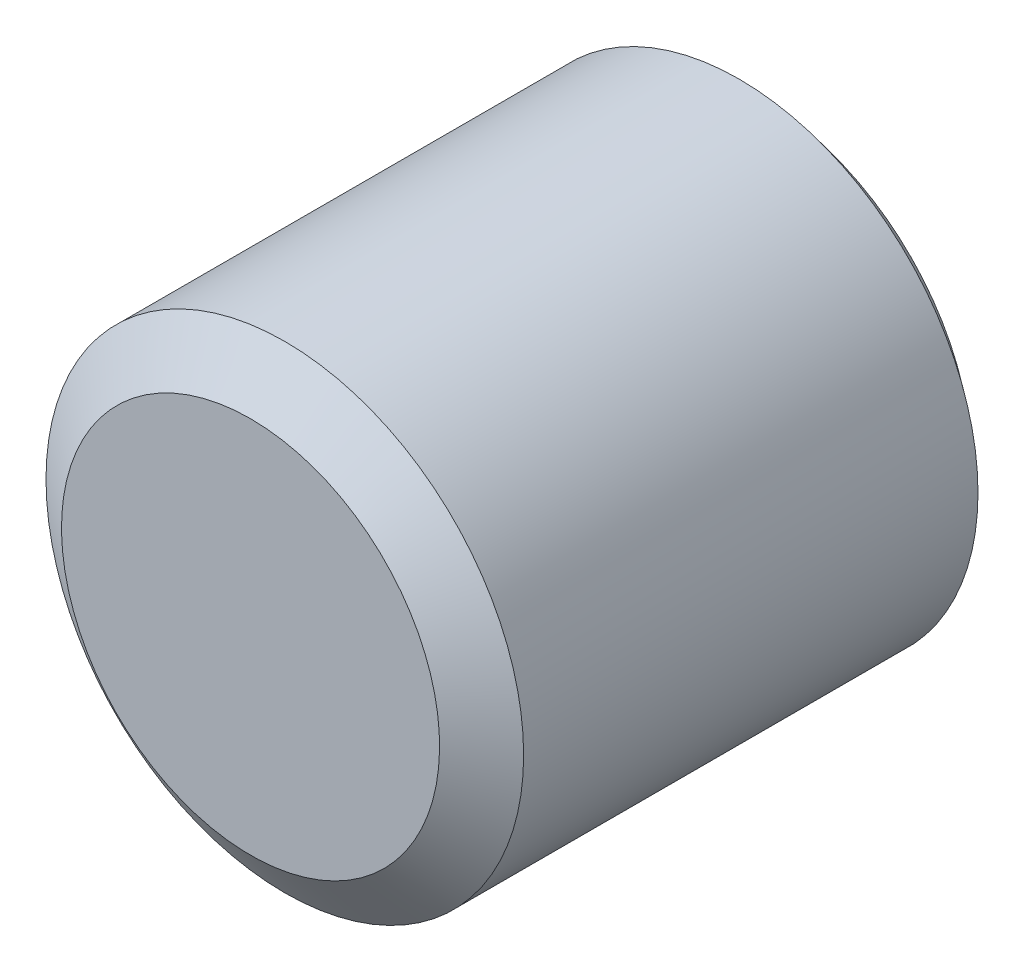
ISO-10303-21;
HEADER;
FILE_DESCRIPTION(('STEP AP214'),'2;1');
FILE_NAME('part.step','',(''),(''),'','','');
FILE_SCHEMA(('AUTOMOTIVE_DESIGN { 1 0 10303 214 1 1 1 1 }'));
ENDSEC;
DATA;
#1=APPLICATION_CONTEXT('core data for automotive mechanical design processes');
#2=APPLICATION_PROTOCOL_DEFINITION('international standard','automotive_design',2000,#1);
#3=PRODUCT_CONTEXT('',#1,'mechanical');
#4=PRODUCT('Part','Part','',(#3));
#5=PRODUCT_RELATED_PRODUCT_CATEGORY('part','',(#4));
#6=PRODUCT_DEFINITION_FORMATION('','',#4);
#7=PRODUCT_DEFINITION_CONTEXT('part definition',#1,'design');
#8=PRODUCT_DEFINITION('design','',#6,#7);
#9=PRODUCT_DEFINITION_SHAPE('','',#8);
#10=(LENGTH_UNIT() NAMED_UNIT(*) SI_UNIT(.MILLI.,.METRE.));
#11=(NAMED_UNIT(*) PLANE_ANGLE_UNIT() SI_UNIT($,.RADIAN.));
#12=(NAMED_UNIT(*) SI_UNIT($,.STERADIAN.) SOLID_ANGLE_UNIT());
#13=UNCERTAINTY_MEASURE_WITH_UNIT(LENGTH_MEASURE(1.E-05),#10,'distance_accuracy_value','');
#14=(GEOMETRIC_REPRESENTATION_CONTEXT(3) GLOBAL_UNCERTAINTY_ASSIGNED_CONTEXT((#13)) GLOBAL_UNIT_ASSIGNED_CONTEXT((#10,
#11,#12)) REPRESENTATION_CONTEXT('',''));
#15=CARTESIAN_POINT('',(0.,0.,0.));
#16=DIRECTION('',(0.,0.,1.));
#17=DIRECTION('',(1.,0.,0.));
#18=AXIS2_PLACEMENT_3D('',#15,#16,#17);
#19=CARTESIAN_POINT('',(0.,0.,0.));
#20=DIRECTION('',(0.,0.,1.));
#21=DIRECTION('',(0.,-1.,0.));
#22=AXIS2_PLACEMENT_3D('',#19,#20,#21);
#23=PLANE('',#22);
#24=CARTESIAN_POINT('',(0.,0.,0.));
#25=DIRECTION('',(0.,0.,-1.));
#26=DIRECTION('',(0.,1.,0.));
#27=AXIS2_PLACEMENT_3D('',#24,#25,#26);
#28=CIRCLE('',#27,11.0816125860374);
#29=CARTESIAN_POINT('',(0.,11.0816125860374,0.));
#30=VERTEX_POINT('',#29);
#31=EDGE_CURVE('E10',#30,#30,#28,.T.);
#32=ORIENTED_EDGE('',*,*,#31,.F.);
#33=EDGE_LOOP('',(#32));
#34=FACE_BOUND('',#33,.T.);
#35=ADVANCED_FACE('F31',(#34),#23,.T.);
#36=CARTESIAN_POINT('',(0.,0.,-2.00983284169124));
#37=DIRECTION('',(0.,0.,-1.));
#38=DIRECTION('',(0.,1.,0.));
#39=AXIS2_PLACEMENT_3D('',#36,#37,#38);
#40=CONICAL_SURFACE('',#39,14.,0.967708660702754);
#41=ORIENTED_EDGE('',*,*,#31,.T.);
#42=EDGE_LOOP('',(#41));
#43=FACE_BOUND('',#42,.T.);
#44=CARTESIAN_POINT('',(0.,0.,-2.00983284169124));
#45=DIRECTION('',(0.,0.,-1.));
#46=DIRECTION('',(0.,1.,0.));
#47=AXIS2_PLACEMENT_3D('',#44,#45,#46);
#48=CIRCLE('',#47,14.);
#49=CARTESIAN_POINT('',(0.,14.,-2.00983284169124));
#50=VERTEX_POINT('',#49);
#51=EDGE_CURVE('E37',#50,#50,#48,.T.);
#52=ORIENTED_EDGE('',*,*,#51,.F.);
#53=EDGE_LOOP('',(#52));
#54=FACE_BOUND('',#53,.T.);
#55=ADVANCED_FACE('F63',(#43,#54),#40,.T.);
#56=CARTESIAN_POINT('',(0.,0.,-30.));
#57=DIRECTION('',(0.,0.,-1.));
#58=DIRECTION('',(0.,1.,0.));
#59=AXIS2_PLACEMENT_3D('',#56,#57,#58);
#60=CYLINDRICAL_SURFACE('',#59,14.);
#61=ORIENTED_EDGE('',*,*,#51,.T.);
#62=EDGE_LOOP('',(#61));
#63=FACE_BOUND('',#62,.T.);
#64=CARTESIAN_POINT('',(0.,0.,-28.6450519690003));
#65=DIRECTION('',(0.,0.,-1.));
#66=DIRECTION('',(0.,1.,0.));
#67=AXIS2_PLACEMENT_3D('',#64,#65,#66);
#68=CIRCLE('',#67,14.);
#69=CARTESIAN_POINT('',(0.,14.,-28.6450519690003));
#70=VERTEX_POINT('',#69);
#71=EDGE_CURVE('E41',#70,#70,#68,.T.);
#72=ORIENTED_EDGE('',*,*,#71,.F.);
#73=EDGE_LOOP('',(#72));
#74=FACE_BOUND('',#73,.T.);
#75=ADVANCED_FACE('F55',(#63,#74),#60,.T.);
#76=CARTESIAN_POINT('',(0.,0.,-30.));
#77=DIRECTION('',(0.,0.,1.));
#78=DIRECTION('',(0.,-1.,0.));
#79=AXIS2_PLACEMENT_3D('',#76,#77,#78);
#80=CONICAL_SURFACE('',#79,12.2760661840718,0.904673387179156);
#81=ORIENTED_EDGE('',*,*,#71,.T.);
#82=EDGE_LOOP('',(#81));
#83=FACE_BOUND('',#82,.T.);
#84=CARTESIAN_POINT('',(0.,0.,-30.));
#85=DIRECTION('',(0.,0.,-1.));
#86=DIRECTION('',(0.,1.,0.));
#87=AXIS2_PLACEMENT_3D('',#84,#85,#86);
#88=CIRCLE('',#87,12.2760661840718);
#89=CARTESIAN_POINT('',(0.,12.2760661840718,-30.));
#90=VERTEX_POINT('',#89);
#91=EDGE_CURVE('E45',#90,#90,#88,.T.);
#92=ORIENTED_EDGE('',*,*,#91,.F.);
#93=EDGE_LOOP('',(#92));
#94=FACE_BOUND('',#93,.T.);
#95=ADVANCED_FACE('F53',(#83,#94),#80,.T.);
#96=CARTESIAN_POINT('',(0.,12.2760661840718,-30.));
#97=DIRECTION('',(0.,0.,-1.));
#98=DIRECTION('',(0.,1.,0.));
#99=AXIS2_PLACEMENT_3D('',#96,#97,#98);
#100=PLANE('',#99);
#101=ORIENTED_EDGE('',*,*,#91,.T.);
#102=EDGE_LOOP('',(#101));
#103=FACE_BOUND('',#102,.T.);
#104=ADVANCED_FACE('F51',(#103),#100,.T.);
#105=CLOSED_SHELL('',(#35,#55,#75,#95,#104));
#106=MANIFOLD_SOLID_BREP('B2',#105);
#107=ADVANCED_BREP_SHAPE_REPRESENTATION('',(#18,#106),#14);
#108=SHAPE_DEFINITION_REPRESENTATION(#9,#107);
ENDSEC;
END-ISO-10303-21;
